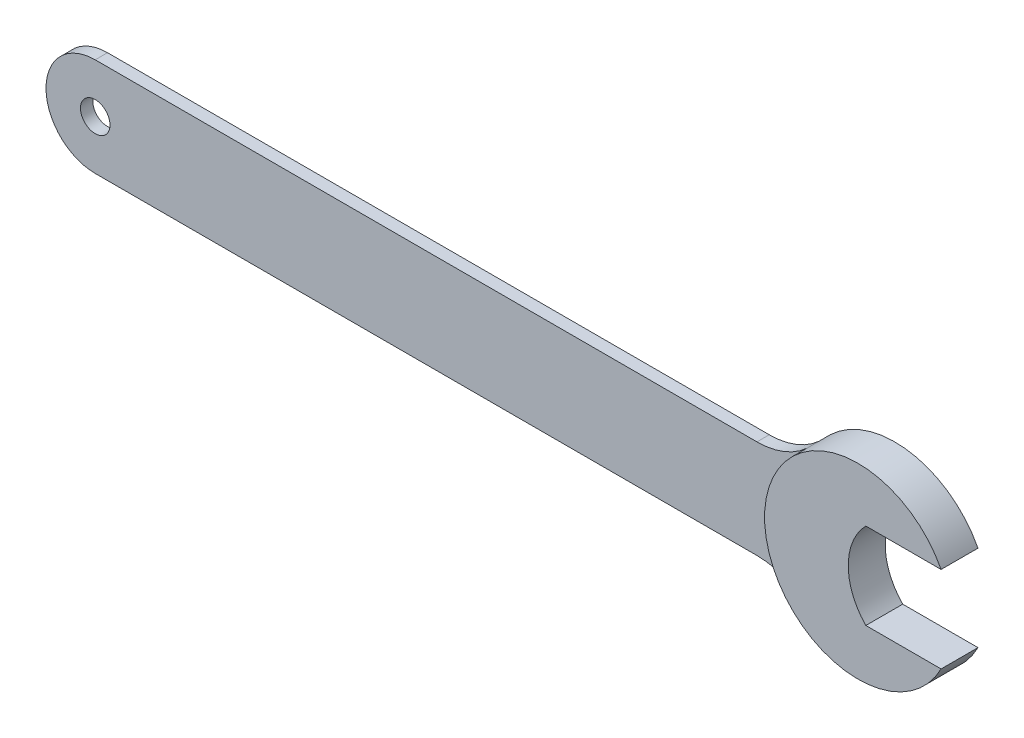
ISO-10303-21;
HEADER;
FILE_DESCRIPTION(('STEP AP214'),'2;1');
FILE_NAME('part.step','',(''),(''),'','','');
FILE_SCHEMA(('AUTOMOTIVE_DESIGN { 1 0 10303 214 1 1 1 1 }'));
ENDSEC;
DATA;
#1=APPLICATION_CONTEXT('core data for automotive mechanical design processes');
#2=APPLICATION_PROTOCOL_DEFINITION('international standard','automotive_design',2000,#1);
#3=PRODUCT_CONTEXT('',#1,'mechanical');
#4=PRODUCT('Part','Part','',(#3));
#5=PRODUCT_RELATED_PRODUCT_CATEGORY('part','',(#4));
#6=PRODUCT_DEFINITION_FORMATION('','',#4);
#7=PRODUCT_DEFINITION_CONTEXT('part definition',#1,'design');
#8=PRODUCT_DEFINITION('design','',#6,#7);
#9=PRODUCT_DEFINITION_SHAPE('','',#8);
#10=(LENGTH_UNIT() NAMED_UNIT(*) SI_UNIT(.MILLI.,.METRE.));
#11=(NAMED_UNIT(*) PLANE_ANGLE_UNIT() SI_UNIT($,.RADIAN.));
#12=(NAMED_UNIT(*) SI_UNIT($,.STERADIAN.) SOLID_ANGLE_UNIT());
#13=UNCERTAINTY_MEASURE_WITH_UNIT(LENGTH_MEASURE(1.E-05),#10,'distance_accuracy_value','');
#14=(GEOMETRIC_REPRESENTATION_CONTEXT(3) GLOBAL_UNCERTAINTY_ASSIGNED_CONTEXT((#13)) GLOBAL_UNIT_ASSIGNED_CONTEXT((#10,
#11,#12)) REPRESENTATION_CONTEXT('',''));
#15=CARTESIAN_POINT('',(0.,0.,0.));
#16=DIRECTION('',(0.,0.,1.));
#17=DIRECTION('',(1.,0.,0.));
#18=AXIS2_PLACEMENT_3D('',#15,#16,#17);
#19=CARTESIAN_POINT('',(268.913125512788,50.,2.5));
#20=DIRECTION('',(0.,0.,-1.));
#21=DIRECTION('',(-1.,0.,0.));
#22=AXIS2_PLACEMENT_3D('',#19,#20,#21);
#23=CYLINDRICAL_SURFACE('',#22,30.);
#24=CARTESIAN_POINT('',(268.913125512788,50.,-2.5));
#25=DIRECTION('',(0.,0.,1.));
#26=DIRECTION('',(1.,0.,0.));
#27=AXIS2_PLACEMENT_3D('',#24,#25,#26);
#28=CIRCLE('',#27,30.);
#29=CARTESIAN_POINT('',(289.245570139499,27.9411764705882,-2.5));
#30=VERTEX_POINT('',#29);
#31=CARTESIAN_POINT('',(268.913125512788,20.,-2.5));
#32=VERTEX_POINT('',#31);
#33=EDGE_CURVE('E187',#30,#32,#28,.F.);
#34=ORIENTED_EDGE('',*,*,#33,.T.);
#35=DIRECTION('',(0.,0.,-1.));
#36=VECTOR('',#35,1.);
#37=CARTESIAN_POINT('',(268.913125512788,20.,2.5));
#38=LINE('',#37,#36);
#39=CARTESIAN_POINT('',(268.913125512788,20.,2.5));
#40=VERTEX_POINT('',#39);
#41=EDGE_CURVE('E51',#40,#32,#38,.T.);
#42=ORIENTED_EDGE('',*,*,#41,.F.);
#43=CARTESIAN_POINT('',(268.913125512788,50.,2.5));
#44=DIRECTION('',(0.,0.,1.));
#45=DIRECTION('',(1.,0.,0.));
#46=AXIS2_PLACEMENT_3D('',#43,#44,#45);
#47=CIRCLE('',#46,30.);
#48=CARTESIAN_POINT('',(289.245570139499,27.9411764705883,2.5));
#49=VERTEX_POINT('',#48);
#50=EDGE_CURVE('E92',#49,#40,#47,.F.);
#51=ORIENTED_EDGE('',*,*,#50,.F.);
#52=DIRECTION('',(0.,0.,-1.));
#53=VECTOR('',#52,1.);
#54=CARTESIAN_POINT('',(289.245570139499,27.9411764705883,2.5));
#55=LINE('',#54,#53);
#56=EDGE_CURVE('E11',#49,#30,#55,.T.);
#57=ORIENTED_EDGE('',*,*,#56,.T.);
#58=EDGE_LOOP('',(#34,#42,#51,#57));
#59=FACE_BOUND('',#58,.T.);
#60=ADVANCED_FACE('F43',(#59),#23,.F.);
#61=CARTESIAN_POINT('',(0.,20.,2.5));
#62=DIRECTION('',(0.,1.,0.));
#63=DIRECTION('',(0.,0.,1.));
#64=AXIS2_PLACEMENT_3D('',#61,#62,#63);
#65=PLANE('',#64);
#66=DIRECTION('',(1.,0.,0.));
#67=VECTOR('',#66,1.);
#68=CARTESIAN_POINT('',(0.,20.,-2.5));
#69=LINE('',#68,#67);
#70=CARTESIAN_POINT('',(0.,20.,-2.5));
#71=VERTEX_POINT('',#70);
#72=EDGE_CURVE('E192',#71,#32,#69,.T.);
#73=ORIENTED_EDGE('',*,*,#72,.F.);
#74=DIRECTION('',(0.,0.,-1.));
#75=VECTOR('',#74,1.);
#76=CARTESIAN_POINT('',(0.,20.,2.5));
#77=LINE('',#76,#75);
#78=CARTESIAN_POINT('',(0.,20.,2.5));
#79=VERTEX_POINT('',#78);
#80=EDGE_CURVE('E206',#79,#71,#77,.T.);
#81=ORIENTED_EDGE('',*,*,#80,.F.);
#82=DIRECTION('',(1.,0.,0.));
#83=VECTOR('',#82,1.);
#84=CARTESIAN_POINT('',(0.,20.,2.5));
#85=LINE('',#84,#83);
#86=EDGE_CURVE('E176',#79,#40,#85,.T.);
#87=ORIENTED_EDGE('',*,*,#86,.T.);
#88=ORIENTED_EDGE('',*,*,#41,.T.);
#89=EDGE_LOOP('',(#73,#81,#87,#88));
#90=FACE_BOUND('',#89,.T.);
#91=ADVANCED_FACE('F213',(#90),#65,.T.);
#92=CARTESIAN_POINT('',(0.,0.,2.5));
#93=DIRECTION('',(0.,0.,-1.));
#94=DIRECTION('',(-1.,0.,0.));
#95=AXIS2_PLACEMENT_3D('',#92,#93,#94);
#96=CYLINDRICAL_SURFACE('',#95,20.);
#97=CARTESIAN_POINT('',(0.,0.,-2.5));
#98=DIRECTION('',(0.,0.,1.));
#99=DIRECTION('',(1.,0.,0.));
#100=AXIS2_PLACEMENT_3D('',#97,#98,#99);
#101=CIRCLE('',#100,20.);
#102=CARTESIAN_POINT('',(0.,-20.,-2.5));
#103=VERTEX_POINT('',#102);
#104=EDGE_CURVE('E191',#71,#103,#101,.T.);
#105=ORIENTED_EDGE('',*,*,#104,.T.);
#106=DIRECTION('',(0.,0.,-1.));
#107=VECTOR('',#106,1.);
#108=CARTESIAN_POINT('',(0.,-20.,2.5));
#109=LINE('',#108,#107);
#110=CARTESIAN_POINT('',(0.,-20.,2.5));
#111=VERTEX_POINT('',#110);
#112=EDGE_CURVE('E203',#111,#103,#109,.T.);
#113=ORIENTED_EDGE('',*,*,#112,.F.);
#114=CARTESIAN_POINT('',(0.,0.,2.5));
#115=DIRECTION('',(0.,0.,1.));
#116=DIRECTION('',(1.,0.,0.));
#117=AXIS2_PLACEMENT_3D('',#114,#115,#116);
#118=CIRCLE('',#117,20.);
#119=EDGE_CURVE('E177',#79,#111,#118,.T.);
#120=ORIENTED_EDGE('',*,*,#119,.F.);
#121=ORIENTED_EDGE('',*,*,#80,.T.);
#122=EDGE_LOOP('',(#105,#113,#120,#121));
#123=FACE_BOUND('',#122,.T.);
#124=ADVANCED_FACE('F221',(#123),#96,.T.);
#125=CARTESIAN_POINT('',(0.,-20.,2.5));
#126=DIRECTION('',(0.,1.,0.));
#127=DIRECTION('',(0.,0.,1.));
#128=AXIS2_PLACEMENT_3D('',#125,#126,#127);
#129=PLANE('',#128);
#130=DIRECTION('',(1.,0.,0.));
#131=VECTOR('',#130,1.);
#132=CARTESIAN_POINT('',(0.,-20.,-2.5));
#133=LINE('',#132,#131);
#134=CARTESIAN_POINT('',(268.913125512788,-20.,-2.5));
#135=VERTEX_POINT('',#134);
#136=EDGE_CURVE('E198',#103,#135,#133,.T.);
#137=ORIENTED_EDGE('',*,*,#136,.T.);
#138=DIRECTION('',(0.,0.,-1.));
#139=VECTOR('',#138,1.);
#140=CARTESIAN_POINT('',(268.913125512788,-20.,2.5));
#141=LINE('',#140,#139);
#142=CARTESIAN_POINT('',(268.913125512788,-20.,2.5));
#143=VERTEX_POINT('',#142);
#144=EDGE_CURVE('E80',#143,#135,#141,.T.);
#145=ORIENTED_EDGE('',*,*,#144,.F.);
#146=DIRECTION('',(1.,0.,0.));
#147=VECTOR('',#146,1.);
#148=CARTESIAN_POINT('',(0.,-20.,2.5));
#149=LINE('',#148,#147);
#150=EDGE_CURVE('E56',#111,#143,#149,.T.);
#151=ORIENTED_EDGE('',*,*,#150,.F.);
#152=ORIENTED_EDGE('',*,*,#112,.T.);
#153=EDGE_LOOP('',(#137,#145,#151,#152));
#154=FACE_BOUND('',#153,.T.);
#155=ADVANCED_FACE('F222',(#154),#129,.F.);
#156=CARTESIAN_POINT('',(268.913125512788,-50.,2.5));
#157=DIRECTION('',(0.,0.,-1.));
#158=DIRECTION('',(-1.,0.,0.));
#159=AXIS2_PLACEMENT_3D('',#156,#157,#158);
#160=CYLINDRICAL_SURFACE('',#159,30.);
#161=CARTESIAN_POINT('',(268.913125512788,-50.,-2.5));
#162=DIRECTION('',(0.,0.,1.));
#163=DIRECTION('',(1.,0.,0.));
#164=AXIS2_PLACEMENT_3D('',#161,#162,#163);
#165=CIRCLE('',#164,30.);
#166=CARTESIAN_POINT('',(289.245570139499,-27.9411764705882,-2.5));
#167=VERTEX_POINT('',#166);
#168=EDGE_CURVE('E196',#167,#135,#165,.T.);
#169=ORIENTED_EDGE('',*,*,#168,.F.);
#170=DIRECTION('',(0.,0.,-1.));
#171=VECTOR('',#170,1.);
#172=CARTESIAN_POINT('',(289.245570139499,-27.9411764705882,2.5));
#173=LINE('',#172,#171);
#174=CARTESIAN_POINT('',(289.245570139499,-27.9411764705882,2.5));
#175=VERTEX_POINT('',#174);
#176=EDGE_CURVE('E90',#175,#167,#173,.T.);
#177=ORIENTED_EDGE('',*,*,#176,.F.);
#178=CARTESIAN_POINT('',(268.913125512788,-50.,2.5));
#179=DIRECTION('',(0.,0.,1.));
#180=DIRECTION('',(1.,0.,0.));
#181=AXIS2_PLACEMENT_3D('',#178,#179,#180);
#182=CIRCLE('',#181,30.);
#183=EDGE_CURVE('E185',#175,#143,#182,.T.);
#184=ORIENTED_EDGE('',*,*,#183,.T.);
#185=ORIENTED_EDGE('',*,*,#144,.T.);
#186=EDGE_LOOP('',(#169,#177,#184,#185));
#187=FACE_BOUND('',#186,.T.);
#188=ADVANCED_FACE('F224',(#187),#160,.F.);
#189=CARTESIAN_POINT('',(0.,0.,2.5));
#190=DIRECTION('',(0.,0.,-1.));
#191=DIRECTION('',(-1.,0.,0.));
#192=AXIS2_PLACEMENT_3D('',#189,#190,#191);
#193=CYLINDRICAL_SURFACE('',#192,6.);
#194=CARTESIAN_POINT('',(0.,0.,2.5));
#195=DIRECTION('',(0.,0.,1.));
#196=DIRECTION('',(1.,0.,0.));
#197=AXIS2_PLACEMENT_3D('',#194,#195,#196);
#198=CIRCLE('',#197,6.);
#199=CARTESIAN_POINT('',(6.,0.,2.5));
#200=VERTEX_POINT('',#199);
#201=EDGE_CURVE('E182',#200,#200,#198,.T.);
#202=ORIENTED_EDGE('',*,*,#201,.T.);
#203=EDGE_LOOP('',(#202));
#204=FACE_BOUND('',#203,.T.);
#205=CARTESIAN_POINT('',(0.,0.,-2.5));
#206=DIRECTION('',(0.,0.,1.));
#207=DIRECTION('',(1.,0.,0.));
#208=AXIS2_PLACEMENT_3D('',#205,#206,#207);
#209=CIRCLE('',#208,6.);
#210=CARTESIAN_POINT('',(6.,0.,-2.5));
#211=VERTEX_POINT('',#210);
#212=EDGE_CURVE('E174',#211,#211,#209,.T.);
#213=ORIENTED_EDGE('',*,*,#212,.F.);
#214=EDGE_LOOP('',(#213));
#215=FACE_BOUND('',#214,.T.);
#216=ADVANCED_FACE('F255',(#204,#215),#193,.F.);
#217=CARTESIAN_POINT('',(0.,0.,2.5));
#218=DIRECTION('',(0.,0.,1.));
#219=DIRECTION('',(1.,0.,0.));
#220=AXIS2_PLACEMENT_3D('',#217,#218,#219);
#221=PLANE('',#220);
#222=CARTESIAN_POINT('',(315.,0.,2.5));
#223=DIRECTION('',(0.,0.,1.));
#224=DIRECTION('',(1.,0.,0.));
#225=AXIS2_PLACEMENT_3D('',#222,#223,#224);
#226=CIRCLE('',#225,38.0000000000001);
#227=EDGE_CURVE('E175',#49,#175,#226,.T.);
#228=ORIENTED_EDGE('',*,*,#227,.F.);
#229=ORIENTED_EDGE('',*,*,#50,.T.);
#230=ORIENTED_EDGE('',*,*,#86,.F.);
#231=ORIENTED_EDGE('',*,*,#119,.T.);
#232=ORIENTED_EDGE('',*,*,#150,.T.);
#233=ORIENTED_EDGE('',*,*,#183,.F.);
#234=EDGE_LOOP('',(#228,#229,#230,#231,#232,#233));
#235=FACE_BOUND('',#234,.T.);
#236=ORIENTED_EDGE('',*,*,#201,.F.);
#237=EDGE_LOOP('',(#236));
#238=FACE_BOUND('',#237,.T.);
#239=ADVANCED_FACE('F226',(#235,#238),#221,.T.);
#240=CARTESIAN_POINT('',(0.,0.,-2.5));
#241=DIRECTION('',(0.,0.,1.));
#242=DIRECTION('',(1.,0.,0.));
#243=AXIS2_PLACEMENT_3D('',#240,#241,#242);
#244=PLANE('',#243);
#245=CARTESIAN_POINT('',(315.,0.,-2.5));
#246=DIRECTION('',(0.,0.,1.));
#247=DIRECTION('',(1.,0.,0.));
#248=AXIS2_PLACEMENT_3D('',#245,#246,#247);
#249=CIRCLE('',#248,38.0000000000001);
#250=EDGE_CURVE('E139',#30,#167,#249,.T.);
#251=ORIENTED_EDGE('',*,*,#250,.T.);
#252=ORIENTED_EDGE('',*,*,#168,.T.);
#253=ORIENTED_EDGE('',*,*,#136,.F.);
#254=ORIENTED_EDGE('',*,*,#104,.F.);
#255=ORIENTED_EDGE('',*,*,#72,.T.);
#256=ORIENTED_EDGE('',*,*,#33,.F.);
#257=EDGE_LOOP('',(#251,#252,#253,#254,#255,#256));
#258=FACE_BOUND('',#257,.T.);
#259=ORIENTED_EDGE('',*,*,#212,.T.);
#260=EDGE_LOOP('',(#259));
#261=FACE_BOUND('',#260,.T.);
#262=ADVANCED_FACE('F218',(#258,#261),#244,.F.);
#263=CARTESIAN_POINT('',(315.,0.,7.5));
#264=DIRECTION('',(0.,0.,-1.));
#265=DIRECTION('',(-1.,0.,0.));
#266=AXIS2_PLACEMENT_3D('',#263,#264,#265);
#267=CYLINDRICAL_SURFACE('',#266,38.);
#268=CARTESIAN_POINT('',(315.,0.,-7.5));
#269=DIRECTION('',(0.,0.,1.));
#270=DIRECTION('',(1.,0.,0.));
#271=AXIS2_PLACEMENT_3D('',#268,#269,#270);
#272=CIRCLE('',#271,38.);
#273=CARTESIAN_POINT('',(348.730549951046,-17.5,-7.5));
#274=VERTEX_POINT('',#273);
#275=CARTESIAN_POINT('',(348.730549951046,17.5,-7.5));
#276=VERTEX_POINT('',#275);
#277=EDGE_CURVE('E140',#274,#276,#272,.F.);
#278=ORIENTED_EDGE('',*,*,#277,.F.);
#279=DIRECTION('',(0.,0.,-1.));
#280=VECTOR('',#279,1.);
#281=CARTESIAN_POINT('',(348.730549951046,-17.5,7.5));
#282=LINE('',#281,#280);
#283=CARTESIAN_POINT('',(348.730549951046,-17.5,7.5));
#284=VERTEX_POINT('',#283);
#285=EDGE_CURVE('E127',#284,#274,#282,.T.);
#286=ORIENTED_EDGE('',*,*,#285,.F.);
#287=CARTESIAN_POINT('',(315.,0.,7.5));
#288=DIRECTION('',(0.,0.,1.));
#289=DIRECTION('',(1.,0.,0.));
#290=AXIS2_PLACEMENT_3D('',#287,#288,#289);
#291=CIRCLE('',#290,38.);
#292=CARTESIAN_POINT('',(348.730549951046,17.5,7.5));
#293=VERTEX_POINT('',#292);
#294=EDGE_CURVE('E132',#284,#293,#291,.F.);
#295=ORIENTED_EDGE('',*,*,#294,.T.);
#296=DIRECTION('',(0.,0.,-1.));
#297=VECTOR('',#296,1.);
#298=CARTESIAN_POINT('',(348.730549951046,17.5,7.5));
#299=LINE('',#298,#297);
#300=EDGE_CURVE('E165',#293,#276,#299,.T.);
#301=ORIENTED_EDGE('',*,*,#300,.T.);
#302=EDGE_LOOP('',(#278,#286,#295,#301));
#303=FACE_BOUND('',#302,.T.);
#304=ORIENTED_EDGE('',*,*,#56,.F.);
#305=ORIENTED_EDGE('',*,*,#227,.T.);
#306=ORIENTED_EDGE('',*,*,#176,.T.);
#307=ORIENTED_EDGE('',*,*,#250,.F.);
#308=EDGE_LOOP('',(#304,#305,#306,#307));
#309=FACE_BOUND('',#308,.T.);
#310=ADVANCED_FACE('F135',(#303,#309),#267,.T.);
#311=CARTESIAN_POINT('',(0.,-17.5,7.5));
#312=DIRECTION('',(0.,-1.,0.));
#313=DIRECTION('',(1.,0.,0.));
#314=AXIS2_PLACEMENT_3D('',#311,#312,#313);
#315=PLANE('',#314);
#316=DIRECTION('',(-1.,0.,0.));
#317=VECTOR('',#316,1.);
#318=CARTESIAN_POINT('',(0.,-17.5,-7.5));
#319=LINE('',#318,#317);
#320=CARTESIAN_POINT('',(318.146428928643,-17.5,-7.5));
#321=VERTEX_POINT('',#320);
#322=EDGE_CURVE('E162',#274,#321,#319,.T.);
#323=ORIENTED_EDGE('',*,*,#322,.T.);
#324=DIRECTION('',(0.,0.,-1.));
#325=VECTOR('',#324,1.);
#326=CARTESIAN_POINT('',(318.146428928643,-17.5,7.5));
#327=LINE('',#326,#325);
#328=CARTESIAN_POINT('',(318.146428928643,-17.5,7.5));
#329=VERTEX_POINT('',#328);
#330=EDGE_CURVE('E141',#329,#321,#327,.T.);
#331=ORIENTED_EDGE('',*,*,#330,.F.);
#332=DIRECTION('',(-1.,0.,0.));
#333=VECTOR('',#332,1.);
#334=CARTESIAN_POINT('',(0.,-17.5,7.5));
#335=LINE('',#334,#333);
#336=EDGE_CURVE('E143',#284,#329,#335,.T.);
#337=ORIENTED_EDGE('',*,*,#336,.F.);
#338=ORIENTED_EDGE('',*,*,#285,.T.);
#339=EDGE_LOOP('',(#323,#331,#337,#338));
#340=FACE_BOUND('',#339,.T.);
#341=ADVANCED_FACE('F144',(#340),#315,.F.);
#342=CARTESIAN_POINT('',(336.,0.,7.5));
#343=DIRECTION('',(0.,0.,-1.));
#344=DIRECTION('',(-1.,0.,0.));
#345=AXIS2_PLACEMENT_3D('',#342,#343,#344);
#346=CYLINDRICAL_SURFACE('',#345,25.);
#347=CARTESIAN_POINT('',(336.,0.,-7.5));
#348=DIRECTION('',(0.,0.,1.));
#349=DIRECTION('',(1.,0.,0.));
#350=AXIS2_PLACEMENT_3D('',#347,#348,#349);
#351=CIRCLE('',#350,25.);
#352=CARTESIAN_POINT('',(318.146428928643,17.5,-7.5));
#353=VERTEX_POINT('',#352);
#354=EDGE_CURVE('E160',#321,#353,#351,.F.);
#355=ORIENTED_EDGE('',*,*,#354,.T.);
#356=DIRECTION('',(0.,0.,-1.));
#357=VECTOR('',#356,1.);
#358=CARTESIAN_POINT('',(318.146428928643,17.5,7.5));
#359=LINE('',#358,#357);
#360=CARTESIAN_POINT('',(318.146428928643,17.5,7.5));
#361=VERTEX_POINT('',#360);
#362=EDGE_CURVE('E170',#361,#353,#359,.T.);
#363=ORIENTED_EDGE('',*,*,#362,.F.);
#364=CARTESIAN_POINT('',(336.,0.,7.5));
#365=DIRECTION('',(0.,0.,1.));
#366=DIRECTION('',(1.,0.,0.));
#367=AXIS2_PLACEMENT_3D('',#364,#365,#366);
#368=CIRCLE('',#367,25.);
#369=EDGE_CURVE('E146',#329,#361,#368,.F.);
#370=ORIENTED_EDGE('',*,*,#369,.F.);
#371=ORIENTED_EDGE('',*,*,#330,.T.);
#372=EDGE_LOOP('',(#355,#363,#370,#371));
#373=FACE_BOUND('',#372,.T.);
#374=ADVANCED_FACE('F233',(#373),#346,.F.);
#375=CARTESIAN_POINT('',(0.,17.5,7.5));
#376=DIRECTION('',(0.,-1.,0.));
#377=DIRECTION('',(1.,0.,0.));
#378=AXIS2_PLACEMENT_3D('',#375,#376,#377);
#379=PLANE('',#378);
#380=DIRECTION('',(-1.,0.,0.));
#381=VECTOR('',#380,1.);
#382=CARTESIAN_POINT('',(0.,17.5,-7.5));
#383=LINE('',#382,#381);
#384=EDGE_CURVE('E152',#276,#353,#383,.T.);
#385=ORIENTED_EDGE('',*,*,#384,.F.);
#386=ORIENTED_EDGE('',*,*,#300,.F.);
#387=DIRECTION('',(-1.,0.,0.));
#388=VECTOR('',#387,1.);
#389=CARTESIAN_POINT('',(0.,17.5,7.5));
#390=LINE('',#389,#388);
#391=EDGE_CURVE('E151',#293,#361,#390,.T.);
#392=ORIENTED_EDGE('',*,*,#391,.T.);
#393=ORIENTED_EDGE('',*,*,#362,.T.);
#394=EDGE_LOOP('',(#385,#386,#392,#393));
#395=FACE_BOUND('',#394,.T.);
#396=ADVANCED_FACE('F295',(#395),#379,.T.);
#397=CARTESIAN_POINT('',(0.,0.,7.5));
#398=DIRECTION('',(0.,0.,1.));
#399=DIRECTION('',(1.,0.,0.));
#400=AXIS2_PLACEMENT_3D('',#397,#398,#399);
#401=PLANE('',#400);
#402=ORIENTED_EDGE('',*,*,#294,.F.);
#403=ORIENTED_EDGE('',*,*,#336,.T.);
#404=ORIENTED_EDGE('',*,*,#369,.T.);
#405=ORIENTED_EDGE('',*,*,#391,.F.);
#406=EDGE_LOOP('',(#402,#403,#404,#405));
#407=FACE_BOUND('',#406,.T.);
#408=ADVANCED_FACE('F153',(#407),#401,.T.);
#409=CARTESIAN_POINT('',(0.,0.,-7.5));
#410=DIRECTION('',(0.,0.,1.));
#411=DIRECTION('',(1.,0.,0.));
#412=AXIS2_PLACEMENT_3D('',#409,#410,#411);
#413=PLANE('',#412);
#414=ORIENTED_EDGE('',*,*,#277,.T.);
#415=ORIENTED_EDGE('',*,*,#384,.T.);
#416=ORIENTED_EDGE('',*,*,#354,.F.);
#417=ORIENTED_EDGE('',*,*,#322,.F.);
#418=EDGE_LOOP('',(#414,#415,#416,#417));
#419=FACE_BOUND('',#418,.T.);
#420=ADVANCED_FACE('F320',(#419),#413,.F.);
#421=CLOSED_SHELL('',(#60,#91,#124,#155,#188,#216,#239,#262,#310,#341,#374,#396,#408,#420));
#422=MANIFOLD_SOLID_BREP('B2',#421);
#423=ADVANCED_BREP_SHAPE_REPRESENTATION('',(#18,#422),#14);
#424=SHAPE_DEFINITION_REPRESENTATION(#9,#423);
ENDSEC;
END-ISO-10303-21;
